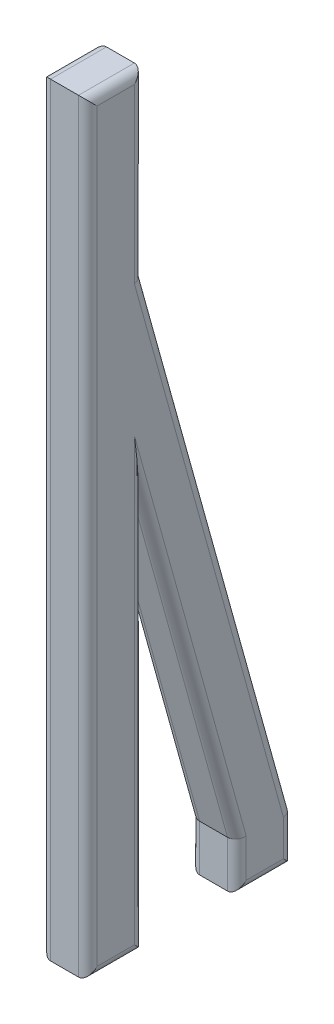
ISO-10303-21;
HEADER;
FILE_DESCRIPTION(('STEP AP214'),'2;1');
FILE_NAME('part.step','',(''),(''),'','','');
FILE_SCHEMA(('AUTOMOTIVE_DESIGN { 1 0 10303 214 1 1 1 1 }'));
ENDSEC;
DATA;
#1=APPLICATION_CONTEXT('core data for automotive mechanical design processes');
#2=APPLICATION_PROTOCOL_DEFINITION('international standard','automotive_design',2000,#1);
#3=PRODUCT_CONTEXT('',#1,'mechanical');
#4=PRODUCT('Part','Part','',(#3));
#5=PRODUCT_RELATED_PRODUCT_CATEGORY('part','',(#4));
#6=PRODUCT_DEFINITION_FORMATION('','',#4);
#7=PRODUCT_DEFINITION_CONTEXT('part definition',#1,'design');
#8=PRODUCT_DEFINITION('design','',#6,#7);
#9=PRODUCT_DEFINITION_SHAPE('','',#8);
#10=(LENGTH_UNIT() NAMED_UNIT(*) SI_UNIT(.MILLI.,.METRE.));
#11=(NAMED_UNIT(*) PLANE_ANGLE_UNIT() SI_UNIT($,.RADIAN.));
#12=(NAMED_UNIT(*) SI_UNIT($,.STERADIAN.) SOLID_ANGLE_UNIT());
#13=UNCERTAINTY_MEASURE_WITH_UNIT(LENGTH_MEASURE(1.E-05),#10,'distance_accuracy_value','');
#14=(GEOMETRIC_REPRESENTATION_CONTEXT(3) GLOBAL_UNCERTAINTY_ASSIGNED_CONTEXT((#13)) GLOBAL_UNIT_ASSIGNED_CONTEXT((#10,
#11,#12)) REPRESENTATION_CONTEXT('',''));
#15=CARTESIAN_POINT('',(0.,0.,0.));
#16=DIRECTION('',(0.,0.,1.));
#17=DIRECTION('',(1.,0.,0.));
#18=AXIS2_PLACEMENT_3D('',#15,#16,#17);
#19=CARTESIAN_POINT('',(5.,1.54727793696275,-5.57020057306589));
#20=DIRECTION('',(0.,-0.267643863786095,0.963517909629941));
#21=DIRECTION('',(0.,-0.963517909629941,-0.267643863786095));
#22=AXIS2_PLACEMENT_3D('',#19,#20,#21);
#23=PLANE('',#22);
#24=DIRECTION('',(-1.,0.,0.));
#25=VECTOR('',#24,1.);
#26=CARTESIAN_POINT('',(5.,0.,-6.));
#27=LINE('',#26,#25);
#28=CARTESIAN_POINT('',(3.,0.,-6.));
#29=VERTEX_POINT('',#28);
#30=CARTESIAN_POINT('',(-3.,0.,-6.));
#31=VERTEX_POINT('',#30);
#32=EDGE_CURVE('E337',#29,#31,#27,.T.);
#33=ORIENTED_EDGE('',*,*,#32,.T.);
#34=DIRECTION('',(0.,0.963517909629941,0.267643863786095));
#35=VECTOR('',#34,1.);
#36=CARTESIAN_POINT('',(-3.,-72.,-26.));
#37=LINE('',#36,#35);
#38=CARTESIAN_POINT('',(-3.,-72.,-26.));
#39=VERTEX_POINT('',#38);
#40=EDGE_CURVE('E277',#31,#39,#37,.F.);
#41=ORIENTED_EDGE('',*,*,#40,.T.);
#42=DIRECTION('',(-1.,0.,0.));
#43=VECTOR('',#42,1.);
#44=CARTESIAN_POINT('',(5.,-72.,-26.));
#45=LINE('',#44,#43);
#46=CARTESIAN_POINT('',(3.,-72.,-26.));
#47=VERTEX_POINT('',#46);
#48=EDGE_CURVE('E207',#47,#39,#45,.T.);
#49=ORIENTED_EDGE('',*,*,#48,.F.);
#50=DIRECTION('',(0.,0.963517909629941,0.267643863786095));
#51=VECTOR('',#50,1.);
#52=CARTESIAN_POINT('',(3.,1.54727793696275,-5.57020057306589));
#53=LINE('',#52,#51);
#54=EDGE_CURVE('E274',#47,#29,#53,.T.);
#55=ORIENTED_EDGE('',*,*,#54,.T.);
#56=EDGE_LOOP('',(#33,#41,#49,#55));
#57=FACE_BOUND('',#56,.T.);
#58=ADVANCED_FACE('F47',(#57),#23,.T.);
#59=CARTESIAN_POINT('',(5.,0.,-26.));
#60=DIRECTION('',(0.,0.,1.));
#61=DIRECTION('',(1.,0.,0.));
#62=AXIS2_PLACEMENT_3D('',#59,#60,#61);
#63=PLANE('',#62);
#64=ORIENTED_EDGE('',*,*,#48,.T.);
#65=DIRECTION('',(0.,1.,0.));
#66=VECTOR('',#65,1.);
#67=CARTESIAN_POINT('',(-3.,-82.,-26.));
#68=LINE('',#67,#66);
#69=CARTESIAN_POINT('',(-3.,-82.,-26.));
#70=VERTEX_POINT('',#69);
#71=EDGE_CURVE('E192',#39,#70,#68,.F.);
#72=ORIENTED_EDGE('',*,*,#71,.T.);
#73=DIRECTION('',(-1.,0.,0.));
#74=VECTOR('',#73,1.);
#75=CARTESIAN_POINT('',(5.,-82.,-26.));
#76=LINE('',#75,#74);
#77=CARTESIAN_POINT('',(3.,-82.,-26.));
#78=VERTEX_POINT('',#77);
#79=EDGE_CURVE('E404',#78,#70,#76,.T.);
#80=ORIENTED_EDGE('',*,*,#79,.F.);
#81=DIRECTION('',(0.,1.,0.));
#82=VECTOR('',#81,1.);
#83=CARTESIAN_POINT('',(3.,0.,-26.));
#84=LINE('',#83,#82);
#85=EDGE_CURVE('E214',#78,#47,#84,.T.);
#86=ORIENTED_EDGE('',*,*,#85,.T.);
#87=EDGE_LOOP('',(#64,#72,#80,#86));
#88=FACE_BOUND('',#87,.T.);
#89=ADVANCED_FACE('F402',(#88),#63,.T.);
#90=CARTESIAN_POINT('',(5.,-82.,0.));
#91=DIRECTION('',(0.,-1.,0.));
#92=DIRECTION('',(0.,0.,-1.));
#93=AXIS2_PLACEMENT_3D('',#90,#91,#92);
#94=PLANE('',#93);
#95=ORIENTED_EDGE('',*,*,#79,.T.);
#96=DIRECTION('',(0.,0.,1.));
#97=VECTOR('',#96,1.);
#98=CARTESIAN_POINT('',(-3.,-82.,-38.));
#99=LINE('',#98,#97);
#100=CARTESIAN_POINT('',(-3.,-82.,-38.));
#101=VERTEX_POINT('',#100);
#102=EDGE_CURVE('E228',#70,#101,#99,.F.);
#103=ORIENTED_EDGE('',*,*,#102,.T.);
#104=DIRECTION('',(-1.,0.,0.));
#105=VECTOR('',#104,1.);
#106=CARTESIAN_POINT('',(5.,-82.,-38.));
#107=LINE('',#106,#105);
#108=CARTESIAN_POINT('',(3.,-82.,-38.));
#109=VERTEX_POINT('',#108);
#110=EDGE_CURVE('E411',#109,#101,#107,.T.);
#111=ORIENTED_EDGE('',*,*,#110,.F.);
#112=DIRECTION('',(0.,0.,1.));
#113=VECTOR('',#112,1.);
#114=CARTESIAN_POINT('',(3.,-82.,0.));
#115=LINE('',#114,#113);
#116=EDGE_CURVE('E225',#109,#78,#115,.T.);
#117=ORIENTED_EDGE('',*,*,#116,.T.);
#118=EDGE_LOOP('',(#95,#103,#111,#117));
#119=FACE_BOUND('',#118,.T.);
#120=ADVANCED_FACE('F445',(#119),#94,.T.);
#121=CARTESIAN_POINT('',(5.,0.,-38.));
#122=DIRECTION('',(0.,0.,-1.));
#123=DIRECTION('',(-1.,0.,0.));
#124=AXIS2_PLACEMENT_3D('',#121,#122,#123);
#125=PLANE('',#124);
#126=ORIENTED_EDGE('',*,*,#110,.T.);
#127=DIRECTION('',(0.,-1.,0.));
#128=VECTOR('',#127,1.);
#129=CARTESIAN_POINT('',(-3.,-72.,-38.));
#130=LINE('',#129,#128);
#131=CARTESIAN_POINT('',(-3.,-72.,-38.));
#132=VERTEX_POINT('',#131);
#133=EDGE_CURVE('E234',#101,#132,#130,.F.);
#134=ORIENTED_EDGE('',*,*,#133,.T.);
#135=DIRECTION('',(-1.,0.,0.));
#136=VECTOR('',#135,1.);
#137=CARTESIAN_POINT('',(5.,-72.,-38.));
#138=LINE('',#137,#136);
#139=CARTESIAN_POINT('',(3.,-72.,-38.));
#140=VERTEX_POINT('',#139);
#141=EDGE_CURVE('E448',#140,#132,#138,.T.);
#142=ORIENTED_EDGE('',*,*,#141,.F.);
#143=DIRECTION('',(0.,-1.,0.));
#144=VECTOR('',#143,1.);
#145=CARTESIAN_POINT('',(3.,0.,-38.));
#146=LINE('',#145,#144);
#147=EDGE_CURVE('E231',#140,#109,#146,.T.);
#148=ORIENTED_EDGE('',*,*,#147,.T.);
#149=EDGE_LOOP('',(#126,#134,#142,#148));
#150=FACE_BOUND('',#149,.T.);
#151=ADVANCED_FACE('F755',(#150),#125,.T.);
#152=CARTESIAN_POINT('',(5.,4.64183381088825,-16.7106017191977));
#153=DIRECTION('',(0.,0.267643863786095,-0.963517909629941));
#154=DIRECTION('',(0.,0.963517909629941,0.267643863786095));
#155=AXIS2_PLACEMENT_3D('',#152,#153,#154);
#156=PLANE('',#155);
#157=ORIENTED_EDGE('',*,*,#141,.T.);
#158=DIRECTION('',(0.,-0.963517909629941,-0.267643863786095));
#159=VECTOR('',#158,1.);
#160=CARTESIAN_POINT('',(-3.,43.1999999999999,-5.99999999999999));
#161=LINE('',#160,#159);
#162=CARTESIAN_POINT('',(-3.,43.1999999999999,-6.));
#163=VERTEX_POINT('',#162);
#164=EDGE_CURVE('E240',#132,#163,#161,.F.);
#165=ORIENTED_EDGE('',*,*,#164,.T.);
#166=DIRECTION('',(-1.,0.,0.));
#167=VECTOR('',#166,1.);
#168=CARTESIAN_POINT('',(5.,43.1999999999999,-6.));
#169=LINE('',#168,#167);
#170=CARTESIAN_POINT('',(3.,43.1999999999999,-6.));
#171=VERTEX_POINT('',#170);
#172=EDGE_CURVE('E451',#171,#163,#169,.T.);
#173=ORIENTED_EDGE('',*,*,#172,.F.);
#174=DIRECTION('',(0.,-0.963517909629941,-0.267643863786095));
#175=VECTOR('',#174,1.);
#176=CARTESIAN_POINT('',(3.,4.64183381088825,-16.7106017191977));
#177=LINE('',#176,#175);
#178=EDGE_CURVE('E237',#171,#140,#177,.T.);
#179=ORIENTED_EDGE('',*,*,#178,.T.);
#180=EDGE_LOOP('',(#157,#165,#173,#179));
#181=FACE_BOUND('',#180,.T.);
#182=ADVANCED_FACE('F505',(#181),#156,.T.);
#183=CARTESIAN_POINT('',(5.,0.,-6.));
#184=DIRECTION('',(0.,0.,-1.));
#185=DIRECTION('',(0.,1.,0.));
#186=AXIS2_PLACEMENT_3D('',#183,#184,#185);
#187=PLANE('',#186);
#188=ORIENTED_EDGE('',*,*,#172,.T.);
#189=DIRECTION('',(0.,-1.,0.));
#190=VECTOR('',#189,1.);
#191=CARTESIAN_POINT('',(-3.,82.,-5.99999999999999));
#192=LINE('',#191,#190);
#193=CARTESIAN_POINT('',(-3.,82.,-5.99999999999999));
#194=VERTEX_POINT('',#193);
#195=EDGE_CURVE('E246',#163,#194,#192,.F.);
#196=ORIENTED_EDGE('',*,*,#195,.T.);
#197=DIRECTION('',(-1.,0.,0.));
#198=VECTOR('',#197,1.);
#199=CARTESIAN_POINT('',(5.,82.,-5.99999999999999));
#200=LINE('',#199,#198);
#201=CARTESIAN_POINT('',(3.,82.,-5.99999999999999));
#202=VERTEX_POINT('',#201);
#203=EDGE_CURVE('E457',#202,#194,#200,.T.);
#204=ORIENTED_EDGE('',*,*,#203,.F.);
#205=DIRECTION('',(0.,-1.,0.));
#206=VECTOR('',#205,1.);
#207=CARTESIAN_POINT('',(3.,0.,-6.));
#208=LINE('',#207,#206);
#209=EDGE_CURVE('E243',#202,#171,#208,.T.);
#210=ORIENTED_EDGE('',*,*,#209,.T.);
#211=EDGE_LOOP('',(#188,#196,#204,#210));
#212=FACE_BOUND('',#211,.T.);
#213=ADVANCED_FACE('F508',(#212),#187,.T.);
#214=CARTESIAN_POINT('',(5.,82.,0.));
#215=DIRECTION('',(0.,1.,0.));
#216=DIRECTION('',(0.,0.,1.));
#217=AXIS2_PLACEMENT_3D('',#214,#215,#216);
#218=PLANE('',#217);
#219=ORIENTED_EDGE('',*,*,#203,.T.);
#220=DIRECTION('',(0.,0.,-1.));
#221=VECTOR('',#220,1.);
#222=CARTESIAN_POINT('',(-3.,82.,6.00000000000001));
#223=LINE('',#222,#221);
#224=CARTESIAN_POINT('',(-3.,82.,6.00000000000001));
#225=VERTEX_POINT('',#224);
#226=EDGE_CURVE('E252',#194,#225,#223,.F.);
#227=ORIENTED_EDGE('',*,*,#226,.T.);
#228=DIRECTION('',(-1.,0.,0.));
#229=VECTOR('',#228,1.);
#230=CARTESIAN_POINT('',(5.,82.,6.00000000000001));
#231=LINE('',#230,#229);
#232=CARTESIAN_POINT('',(3.,82.,6.00000000000001));
#233=VERTEX_POINT('',#232);
#234=EDGE_CURVE('E461',#233,#225,#231,.T.);
#235=ORIENTED_EDGE('',*,*,#234,.F.);
#236=DIRECTION('',(0.,0.,-1.));
#237=VECTOR('',#236,1.);
#238=CARTESIAN_POINT('',(3.,82.,0.));
#239=LINE('',#238,#237);
#240=EDGE_CURVE('E249',#233,#202,#239,.T.);
#241=ORIENTED_EDGE('',*,*,#240,.T.);
#242=EDGE_LOOP('',(#219,#227,#235,#241));
#243=FACE_BOUND('',#242,.T.);
#244=ADVANCED_FACE('F732',(#243),#218,.T.);
#245=CARTESIAN_POINT('',(5.,0.,6.));
#246=DIRECTION('',(0.,0.,-1.));
#247=DIRECTION('',(0.,1.,0.));
#248=AXIS2_PLACEMENT_3D('',#245,#246,#247);
#249=PLANE('',#248);
#250=ORIENTED_EDGE('',*,*,#234,.T.);
#251=DIRECTION('',(0.,-1.,0.));
#252=VECTOR('',#251,1.);
#253=CARTESIAN_POINT('',(-3.,0.,6.));
#254=LINE('',#253,#252);
#255=CARTESIAN_POINT('',(-3.,-82.,5.99999999999999));
#256=VERTEX_POINT('',#255);
#257=EDGE_CURVE('E258',#225,#256,#254,.T.);
#258=ORIENTED_EDGE('',*,*,#257,.T.);
#259=DIRECTION('',(-1.,0.,0.));
#260=VECTOR('',#259,1.);
#261=CARTESIAN_POINT('',(5.,-82.,5.99999999999999));
#262=LINE('',#261,#260);
#263=CARTESIAN_POINT('',(3.,-82.,5.99999999999999));
#264=VERTEX_POINT('',#263);
#265=EDGE_CURVE('E465',#264,#256,#262,.T.);
#266=ORIENTED_EDGE('',*,*,#265,.F.);
#267=DIRECTION('',(0.,-1.,0.));
#268=VECTOR('',#267,1.);
#269=CARTESIAN_POINT('',(3.,82.,6.00000000000001));
#270=LINE('',#269,#268);
#271=EDGE_CURVE('E255',#264,#233,#270,.F.);
#272=ORIENTED_EDGE('',*,*,#271,.T.);
#273=EDGE_LOOP('',(#250,#258,#266,#272));
#274=FACE_BOUND('',#273,.T.);
#275=ADVANCED_FACE('F723',(#274),#249,.F.);
#276=CARTESIAN_POINT('',(5.,-82.,0.));
#277=DIRECTION('',(0.,1.,0.));
#278=DIRECTION('',(0.,0.,1.));
#279=AXIS2_PLACEMENT_3D('',#276,#277,#278);
#280=PLANE('',#279);
#281=ORIENTED_EDGE('',*,*,#265,.T.);
#282=DIRECTION('',(0.,0.,-1.));
#283=VECTOR('',#282,1.);
#284=CARTESIAN_POINT('',(-3.,-82.,0.));
#285=LINE('',#284,#283);
#286=CARTESIAN_POINT('',(-3.,-82.,-6.00000000000001));
#287=VERTEX_POINT('',#286);
#288=EDGE_CURVE('E264',#256,#287,#285,.T.);
#289=ORIENTED_EDGE('',*,*,#288,.T.);
#290=DIRECTION('',(-1.,0.,0.));
#291=VECTOR('',#290,1.);
#292=CARTESIAN_POINT('',(5.,-82.,-6.00000000000001));
#293=LINE('',#292,#291);
#294=CARTESIAN_POINT('',(3.,-82.,-6.00000000000001));
#295=VERTEX_POINT('',#294);
#296=EDGE_CURVE('E469',#295,#287,#293,.T.);
#297=ORIENTED_EDGE('',*,*,#296,.F.);
#298=DIRECTION('',(0.,0.,-1.));
#299=VECTOR('',#298,1.);
#300=CARTESIAN_POINT('',(3.,-82.,5.99999999999999));
#301=LINE('',#300,#299);
#302=EDGE_CURVE('E261',#295,#264,#301,.F.);
#303=ORIENTED_EDGE('',*,*,#302,.T.);
#304=EDGE_LOOP('',(#281,#289,#297,#303));
#305=FACE_BOUND('',#304,.T.);
#306=ADVANCED_FACE('F715',(#305),#280,.F.);
#307=ORIENTED_EDGE('',*,*,#296,.T.);
#308=DIRECTION('',(0.,-1.,0.));
#309=VECTOR('',#308,1.);
#310=CARTESIAN_POINT('',(-3.,0.,-6.));
#311=LINE('',#310,#309);
#312=EDGE_CURVE('E271',#287,#31,#311,.F.);
#313=ORIENTED_EDGE('',*,*,#312,.T.);
#314=ORIENTED_EDGE('',*,*,#32,.F.);
#315=DIRECTION('',(0.,-1.,0.));
#316=VECTOR('',#315,1.);
#317=CARTESIAN_POINT('',(3.,0.,-6.));
#318=LINE('',#317,#316);
#319=EDGE_CURVE('E267',#29,#295,#318,.T.);
#320=ORIENTED_EDGE('',*,*,#319,.T.);
#321=EDGE_LOOP('',(#307,#313,#314,#320));
#322=FACE_BOUND('',#321,.T.);
#323=ADVANCED_FACE('F707',(#322),#187,.T.);
#324=CARTESIAN_POINT('',(5.,0.,0.));
#325=DIRECTION('',(1.,0.,0.));
#326=DIRECTION('',(0.,0.,-1.));
#327=AXIS2_PLACEMENT_3D('',#324,#325,#326);
#328=PLANE('',#327);
#329=DIRECTION('',(0.,0.,-1.));
#330=VECTOR('',#329,1.);
#331=CARTESIAN_POINT('',(5.,-80.,-6.00000000000001));
#332=LINE('',#331,#330);
#333=CARTESIAN_POINT('',(5.,-80.,3.99999999999999));
#334=VERTEX_POINT('',#333);
#335=CARTESIAN_POINT('',(5.,-80.,-4.00000000000001));
#336=VERTEX_POINT('',#335);
#337=EDGE_CURVE('E57',#334,#336,#332,.T.);
#338=ORIENTED_EDGE('',*,*,#337,.T.);
#339=DIRECTION('',(0.,-1.,0.));
#340=VECTOR('',#339,1.);
#341=CARTESIAN_POINT('',(5.,0.,-4.));
#342=LINE('',#341,#340);
#343=CARTESIAN_POINT('',(5.,14.6726166769077,-4.));
#344=VERTEX_POINT('',#343);
#345=EDGE_CURVE('E11',#336,#344,#342,.F.);
#346=ORIENTED_EDGE('',*,*,#345,.T.);
#347=DIRECTION('',(0.,0.963517909629941,0.267643863786095));
#348=VECTOR('',#347,1.);
#349=CARTESIAN_POINT('',(5.,2.08256566453494,-7.49723639232578));
#350=LINE('',#349,#348);
#351=CARTESIAN_POINT('',(5.,-71.7273833230922,-28.));
#352=VERTEX_POINT('',#351);
#353=EDGE_CURVE('E280',#344,#352,#350,.F.);
#354=ORIENTED_EDGE('',*,*,#353,.T.);
#355=DIRECTION('',(0.,1.,0.));
#356=VECTOR('',#355,1.);
#357=CARTESIAN_POINT('',(5.,0.,-28.));
#358=LINE('',#357,#356);
#359=CARTESIAN_POINT('',(5.,-80.,-28.));
#360=VERTEX_POINT('',#359);
#361=EDGE_CURVE('E283',#352,#360,#358,.F.);
#362=ORIENTED_EDGE('',*,*,#361,.T.);
#363=DIRECTION('',(0.,0.,1.));
#364=VECTOR('',#363,1.);
#365=CARTESIAN_POINT('',(5.,-80.,0.));
#366=LINE('',#365,#364);
#367=CARTESIAN_POINT('',(5.,-80.,-36.));
#368=VERTEX_POINT('',#367);
#369=EDGE_CURVE('E286',#360,#368,#366,.F.);
#370=ORIENTED_EDGE('',*,*,#369,.T.);
#371=DIRECTION('',(0.,-1.,0.));
#372=VECTOR('',#371,1.);
#373=CARTESIAN_POINT('',(5.,0.,-36.));
#374=LINE('',#373,#372);
#375=CARTESIAN_POINT('',(5.,-72.2726166769077,-36.));
#376=VERTEX_POINT('',#375);
#377=EDGE_CURVE('E289',#368,#376,#374,.F.);
#378=ORIENTED_EDGE('',*,*,#377,.T.);
#379=DIRECTION('',(0.,-0.963517909629941,-0.267643863786095));
#380=VECTOR('',#379,1.);
#381=CARTESIAN_POINT('',(5.,4.10654608331606,-14.7835658999378));
#382=LINE('',#381,#380);
#383=CARTESIAN_POINT('',(5.,42.9273833230921,-3.99999999999999));
#384=VERTEX_POINT('',#383);
#385=EDGE_CURVE('E292',#376,#384,#382,.F.);
#386=ORIENTED_EDGE('',*,*,#385,.T.);
#387=DIRECTION('',(0.,-1.,0.));
#388=VECTOR('',#387,1.);
#389=CARTESIAN_POINT('',(5.,0.,-4.));
#390=LINE('',#389,#388);
#391=CARTESIAN_POINT('',(5.,80.,-3.99999999999999));
#392=VERTEX_POINT('',#391);
#393=EDGE_CURVE('E295',#384,#392,#390,.F.);
#394=ORIENTED_EDGE('',*,*,#393,.T.);
#395=DIRECTION('',(0.,0.,-1.));
#396=VECTOR('',#395,1.);
#397=CARTESIAN_POINT('',(5.,80.,0.));
#398=LINE('',#397,#396);
#399=CARTESIAN_POINT('',(5.,80.,4.00000000000001));
#400=VERTEX_POINT('',#399);
#401=EDGE_CURVE('E298',#392,#400,#398,.F.);
#402=ORIENTED_EDGE('',*,*,#401,.T.);
#403=DIRECTION('',(0.,-1.,0.));
#404=VECTOR('',#403,1.);
#405=CARTESIAN_POINT('',(5.,-82.,3.99999999999999));
#406=LINE('',#405,#404);
#407=EDGE_CURVE('E68',#400,#334,#406,.T.);
#408=ORIENTED_EDGE('',*,*,#407,.T.);
#409=EDGE_LOOP('',(#338,#346,#354,#362,#370,#378,#386,#394,#402,#408));
#410=FACE_BOUND('',#409,.T.);
#411=ADVANCED_FACE('F385',(#410),#328,.T.);
#412=CARTESIAN_POINT('',(-5.,0.,0.));
#413=DIRECTION('',(1.,0.,0.));
#414=DIRECTION('',(0.,0.,-1.));
#415=AXIS2_PLACEMENT_3D('',#412,#413,#414);
#416=PLANE('',#415);
#417=DIRECTION('',(0.,0.,1.));
#418=VECTOR('',#417,1.);
#419=CARTESIAN_POINT('',(-5.,-80.,-26.));
#420=LINE('',#419,#418);
#421=CARTESIAN_POINT('',(-5.,-80.,-36.));
#422=VERTEX_POINT('',#421);
#423=CARTESIAN_POINT('',(-5.,-80.,-28.));
#424=VERTEX_POINT('',#423);
#425=EDGE_CURVE('E211',#422,#424,#420,.T.);
#426=ORIENTED_EDGE('',*,*,#425,.T.);
#427=DIRECTION('',(0.,1.,0.));
#428=VECTOR('',#427,1.);
#429=CARTESIAN_POINT('',(-5.,-72.,-28.));
#430=LINE('',#429,#428);
#431=CARTESIAN_POINT('',(-5.,-71.7273833230922,-28.));
#432=VERTEX_POINT('',#431);
#433=EDGE_CURVE('E190',#424,#432,#430,.T.);
#434=ORIENTED_EDGE('',*,*,#433,.T.);
#435=DIRECTION('',(0.,0.963517909629941,0.267643863786095));
#436=VECTOR('',#435,1.);
#437=CARTESIAN_POINT('',(-5.,0.535287727572151,-7.92703581925988));
#438=LINE('',#437,#436);
#439=CARTESIAN_POINT('',(-5.,14.6726166769077,-4.));
#440=VERTEX_POINT('',#439);
#441=EDGE_CURVE('E199',#432,#440,#438,.T.);
#442=ORIENTED_EDGE('',*,*,#441,.T.);
#443=DIRECTION('',(0.,-1.,0.));
#444=VECTOR('',#443,1.);
#445=CARTESIAN_POINT('',(-5.,-82.,-4.00000000000001));
#446=LINE('',#445,#444);
#447=CARTESIAN_POINT('',(-5.,-80.,-4.00000000000001));
#448=VERTEX_POINT('',#447);
#449=EDGE_CURVE('E206',#440,#448,#446,.T.);
#450=ORIENTED_EDGE('',*,*,#449,.T.);
#451=DIRECTION('',(0.,0.,-1.));
#452=VECTOR('',#451,1.);
#453=CARTESIAN_POINT('',(-5.,-80.,0.));
#454=LINE('',#453,#452);
#455=CARTESIAN_POINT('',(-5.,-80.,3.99999999999999));
#456=VERTEX_POINT('',#455);
#457=EDGE_CURVE('E417',#448,#456,#454,.F.);
#458=ORIENTED_EDGE('',*,*,#457,.T.);
#459=DIRECTION('',(0.,-1.,0.));
#460=VECTOR('',#459,1.);
#461=CARTESIAN_POINT('',(-5.,0.,4.));
#462=LINE('',#461,#460);
#463=CARTESIAN_POINT('',(-5.,80.,4.00000000000001));
#464=VERTEX_POINT('',#463);
#465=EDGE_CURVE('E420',#456,#464,#462,.F.);
#466=ORIENTED_EDGE('',*,*,#465,.T.);
#467=DIRECTION('',(0.,0.,-1.));
#468=VECTOR('',#467,1.);
#469=CARTESIAN_POINT('',(-5.,80.,-5.99999999999999));
#470=LINE('',#469,#468);
#471=CARTESIAN_POINT('',(-5.,80.,-3.99999999999999));
#472=VERTEX_POINT('',#471);
#473=EDGE_CURVE('E423',#464,#472,#470,.T.);
#474=ORIENTED_EDGE('',*,*,#473,.T.);
#475=DIRECTION('',(0.,-1.,0.));
#476=VECTOR('',#475,1.);
#477=CARTESIAN_POINT('',(-5.,43.1999999999999,-3.99999999999999));
#478=LINE('',#477,#476);
#479=CARTESIAN_POINT('',(-5.,42.9273833230921,-3.99999999999999));
#480=VERTEX_POINT('',#479);
#481=EDGE_CURVE('E426',#472,#480,#478,.T.);
#482=ORIENTED_EDGE('',*,*,#481,.T.);
#483=DIRECTION('',(0.,-0.963517909629941,-0.267643863786095));
#484=VECTOR('',#483,1.);
#485=CARTESIAN_POINT('',(-5.,-72.5352877275722,-36.0729641807401));
#486=LINE('',#485,#484);
#487=CARTESIAN_POINT('',(-5.,-72.2726166769077,-36.));
#488=VERTEX_POINT('',#487);
#489=EDGE_CURVE('E429',#480,#488,#486,.T.);
#490=ORIENTED_EDGE('',*,*,#489,.T.);
#491=DIRECTION('',(0.,-1.,0.));
#492=VECTOR('',#491,1.);
#493=CARTESIAN_POINT('',(-5.,-82.,-36.));
#494=LINE('',#493,#492);
#495=EDGE_CURVE('E219',#488,#422,#494,.T.);
#496=ORIENTED_EDGE('',*,*,#495,.T.);
#497=EDGE_LOOP('',(#426,#434,#442,#450,#458,#466,#474,#482,#490,#496));
#498=FACE_BOUND('',#497,.T.);
#499=ADVANCED_FACE('F209',(#498),#416,.F.);
#500=CARTESIAN_POINT('',(-3.,80.,0.));
#501=DIRECTION('',(0.,0.,1.));
#502=DIRECTION('',(1.,0.,0.));
#503=AXIS2_PLACEMENT_3D('',#500,#501,#502);
#504=CYLINDRICAL_SURFACE('',#503,2.);
#505=CARTESIAN_POINT('',(-3.,80.,4.00000000000001));
#506=DIRECTION('',(0.,-0.707106781186548,0.707106781186547));
#507=DIRECTION('',(0.,-0.707106781186547,-0.707106781186548));
#508=AXIS2_PLACEMENT_3D('',#505,#506,#507);
#509=ELLIPSE('',#508,2.82842712474619,2.);
#510=EDGE_CURVE('E329',#225,#464,#509,.T.);
#511=ORIENTED_EDGE('',*,*,#510,.F.);
#512=ORIENTED_EDGE('',*,*,#226,.F.);
#513=CARTESIAN_POINT('',(-3.,80.,-3.99999999999999));
#514=DIRECTION('',(0.,0.707106781186547,0.707106781186548));
#515=DIRECTION('',(0.,-0.707106781186548,0.707106781186547));
#516=AXIS2_PLACEMENT_3D('',#513,#514,#515);
#517=ELLIPSE('',#516,2.82842712474619,2.);
#518=EDGE_CURVE('E333',#472,#194,#517,.F.);
#519=ORIENTED_EDGE('',*,*,#518,.F.);
#520=ORIENTED_EDGE('',*,*,#473,.F.);
#521=EDGE_LOOP('',(#511,#512,#519,#520));
#522=FACE_BOUND('',#521,.T.);
#523=ADVANCED_FACE('F493',(#522),#504,.T.);
#524=CARTESIAN_POINT('',(-3.,0.,-4.));
#525=DIRECTION('',(0.,1.,0.));
#526=DIRECTION('',(0.,0.,1.));
#527=AXIS2_PLACEMENT_3D('',#524,#525,#526);
#528=CYLINDRICAL_SURFACE('',#527,2.);
#529=ORIENTED_EDGE('',*,*,#518,.T.);
#530=ORIENTED_EDGE('',*,*,#195,.F.);
#531=CARTESIAN_POINT('',(-3.,42.9273833230921,-4.));
#532=DIRECTION('',(0.,0.990837501720121,0.135059413537264));
#533=DIRECTION('',(0.,-0.135059413537264,0.990837501720121));
#534=AXIS2_PLACEMENT_3D('',#531,#532,#533);
#535=ELLIPSE('',#534,2.01849445194388,2.);
#536=EDGE_CURVE('E325',#480,#163,#535,.F.);
#537=ORIENTED_EDGE('',*,*,#536,.F.);
#538=ORIENTED_EDGE('',*,*,#481,.F.);
#539=EDGE_LOOP('',(#529,#530,#537,#538));
#540=FACE_BOUND('',#539,.T.);
#541=ADVANCED_FACE('F499',(#540),#528,.T.);
#542=CARTESIAN_POINT('',(-3.,0.,4.));
#543=DIRECTION('',(0.,-1.,0.));
#544=DIRECTION('',(0.,0.,-1.));
#545=AXIS2_PLACEMENT_3D('',#542,#543,#544);
#546=CYLINDRICAL_SURFACE('',#545,2.);
#547=ORIENTED_EDGE('',*,*,#510,.T.);
#548=ORIENTED_EDGE('',*,*,#465,.F.);
#549=CARTESIAN_POINT('',(-3.,-80.,3.99999999999999));
#550=DIRECTION('',(0.,-0.707106781186547,-0.707106781186548));
#551=DIRECTION('',(0.,0.707106781186548,-0.707106781186547));
#552=AXIS2_PLACEMENT_3D('',#549,#550,#551);
#553=ELLIPSE('',#552,2.82842712474619,2.);
#554=EDGE_CURVE('E321',#256,#456,#553,.T.);
#555=ORIENTED_EDGE('',*,*,#554,.F.);
#556=ORIENTED_EDGE('',*,*,#257,.F.);
#557=EDGE_LOOP('',(#547,#548,#555,#556));
#558=FACE_BOUND('',#557,.T.);
#559=ADVANCED_FACE('F488',(#558),#546,.T.);
#560=CARTESIAN_POINT('',(-3.,4.10654608331606,-14.7835658999378));
#561=DIRECTION('',(0.,0.963517909629941,0.267643863786095));
#562=DIRECTION('',(0.,-0.267643863786095,0.963517909629941));
#563=AXIS2_PLACEMENT_3D('',#560,#561,#562);
#564=CYLINDRICAL_SURFACE('',#563,2.);
#565=ORIENTED_EDGE('',*,*,#536,.T.);
#566=ORIENTED_EDGE('',*,*,#164,.F.);
#567=CARTESIAN_POINT('',(-3.,-72.2726166769077,-36.));
#568=DIRECTION('',(0.,0.990837501720121,0.135059413537264));
#569=DIRECTION('',(0.,-0.135059413537264,0.990837501720121));
#570=AXIS2_PLACEMENT_3D('',#567,#568,#569);
#571=ELLIPSE('',#570,2.01849445194388,2.);
#572=EDGE_CURVE('E317',#488,#132,#571,.F.);
#573=ORIENTED_EDGE('',*,*,#572,.F.);
#574=ORIENTED_EDGE('',*,*,#489,.F.);
#575=EDGE_LOOP('',(#565,#566,#573,#574));
#576=FACE_BOUND('',#575,.T.);
#577=ADVANCED_FACE('F502',(#576),#564,.T.);
#578=CARTESIAN_POINT('',(-3.,-80.,0.));
#579=DIRECTION('',(0.,0.,-1.));
#580=DIRECTION('',(-1.,0.,0.));
#581=AXIS2_PLACEMENT_3D('',#578,#579,#580);
#582=CYLINDRICAL_SURFACE('',#581,2.);
#583=ORIENTED_EDGE('',*,*,#554,.T.);
#584=ORIENTED_EDGE('',*,*,#457,.F.);
#585=CARTESIAN_POINT('',(-3.,-80.,-4.00000000000001));
#586=DIRECTION('',(0.,0.707106781186548,-0.707106781186547));
#587=DIRECTION('',(0.,0.707106781186547,0.707106781186548));
#588=AXIS2_PLACEMENT_3D('',#585,#586,#587);
#589=ELLIPSE('',#588,2.82842712474619,2.);
#590=EDGE_CURVE('E313',#287,#448,#589,.T.);
#591=ORIENTED_EDGE('',*,*,#590,.F.);
#592=ORIENTED_EDGE('',*,*,#288,.F.);
#593=EDGE_LOOP('',(#583,#584,#591,#592));
#594=FACE_BOUND('',#593,.T.);
#595=ADVANCED_FACE('F483',(#594),#582,.T.);
#596=CARTESIAN_POINT('',(-3.,0.,-36.));
#597=DIRECTION('',(0.,1.,0.));
#598=DIRECTION('',(0.,0.,1.));
#599=AXIS2_PLACEMENT_3D('',#596,#597,#598);
#600=CYLINDRICAL_SURFACE('',#599,2.);
#601=ORIENTED_EDGE('',*,*,#572,.T.);
#602=ORIENTED_EDGE('',*,*,#133,.F.);
#603=CARTESIAN_POINT('',(-3.,-80.,-36.));
#604=DIRECTION('',(0.,0.707106781186548,-0.707106781186547));
#605=DIRECTION('',(0.,0.707106781186547,0.707106781186548));
#606=AXIS2_PLACEMENT_3D('',#603,#604,#605);
#607=ELLIPSE('',#606,2.82842712474619,2.);
#608=EDGE_CURVE('E309',#422,#101,#607,.F.);
#609=ORIENTED_EDGE('',*,*,#608,.F.);
#610=ORIENTED_EDGE('',*,*,#495,.F.);
#611=EDGE_LOOP('',(#601,#602,#609,#610));
#612=FACE_BOUND('',#611,.T.);
#613=ADVANCED_FACE('F438',(#612),#600,.T.);
#614=CARTESIAN_POINT('',(-3.,0.,-4.));
#615=DIRECTION('',(0.,1.,0.));
#616=DIRECTION('',(0.,0.,1.));
#617=AXIS2_PLACEMENT_3D('',#614,#615,#616);
#618=CYLINDRICAL_SURFACE('',#617,2.);
#619=ORIENTED_EDGE('',*,*,#590,.T.);
#620=ORIENTED_EDGE('',*,*,#449,.F.);
#621=CARTESIAN_POINT('',(-3.,14.6726166769077,-4.));
#622=DIRECTION('',(0.,0.135059413537264,-0.990837501720121));
#623=DIRECTION('',(0.,0.990837501720121,0.135059413537264));
#624=AXIS2_PLACEMENT_3D('',#621,#622,#623);
#625=ELLIPSE('',#624,14.8082976789188,2.);
#626=EDGE_CURVE('E202',#31,#440,#625,.T.);
#627=ORIENTED_EDGE('',*,*,#626,.F.);
#628=ORIENTED_EDGE('',*,*,#312,.F.);
#629=EDGE_LOOP('',(#619,#620,#627,#628));
#630=FACE_BOUND('',#629,.T.);
#631=ADVANCED_FACE('F478',(#630),#618,.T.);
#632=CARTESIAN_POINT('',(-3.,-80.,0.));
#633=DIRECTION('',(0.,0.,-1.));
#634=DIRECTION('',(0.,1.,0.));
#635=AXIS2_PLACEMENT_3D('',#632,#633,#634);
#636=CYLINDRICAL_SURFACE('',#635,2.);
#637=ORIENTED_EDGE('',*,*,#608,.T.);
#638=ORIENTED_EDGE('',*,*,#102,.F.);
#639=CARTESIAN_POINT('',(-3.,-80.,-28.));
#640=DIRECTION('',(0.,-0.707106781186547,-0.707106781186548));
#641=DIRECTION('',(0.,0.707106781186548,-0.707106781186547));
#642=AXIS2_PLACEMENT_3D('',#639,#640,#641);
#643=ELLIPSE('',#642,2.82842712474619,2.);
#644=EDGE_CURVE('E196',#424,#70,#643,.F.);
#645=ORIENTED_EDGE('',*,*,#644,.F.);
#646=ORIENTED_EDGE('',*,*,#425,.F.);
#647=EDGE_LOOP('',(#637,#638,#645,#646));
#648=FACE_BOUND('',#647,.T.);
#649=ADVANCED_FACE('F441',(#648),#636,.T.);
#650=CARTESIAN_POINT('',(-3.,2.08256566453494,-7.49723639232577));
#651=DIRECTION('',(0.,-0.963517909629941,-0.267643863786095));
#652=DIRECTION('',(0.,0.267643863786095,-0.963517909629941));
#653=AXIS2_PLACEMENT_3D('',#650,#651,#652);
#654=CYLINDRICAL_SURFACE('',#653,2.);
#655=ORIENTED_EDGE('',*,*,#626,.T.);
#656=ORIENTED_EDGE('',*,*,#441,.F.);
#657=CARTESIAN_POINT('',(-3.,-71.7273833230922,-28.));
#658=DIRECTION('',(0.,-0.990837501720121,-0.135059413537264));
#659=DIRECTION('',(0.,-0.135059413537264,0.990837501720121));
#660=AXIS2_PLACEMENT_3D('',#657,#658,#659);
#661=ELLIPSE('',#660,2.01849445194388,2.);
#662=EDGE_CURVE('E186',#39,#432,#661,.T.);
#663=ORIENTED_EDGE('',*,*,#662,.F.);
#664=ORIENTED_EDGE('',*,*,#40,.F.);
#665=EDGE_LOOP('',(#655,#656,#663,#664));
#666=FACE_BOUND('',#665,.T.);
#667=ADVANCED_FACE('F200',(#666),#654,.T.);
#668=CARTESIAN_POINT('',(-3.,0.,-28.));
#669=DIRECTION('',(0.,-1.,0.));
#670=DIRECTION('',(0.,0.,-1.));
#671=AXIS2_PLACEMENT_3D('',#668,#669,#670);
#672=CYLINDRICAL_SURFACE('',#671,2.);
#673=ORIENTED_EDGE('',*,*,#644,.T.);
#674=ORIENTED_EDGE('',*,*,#71,.F.);
#675=ORIENTED_EDGE('',*,*,#662,.T.);
#676=ORIENTED_EDGE('',*,*,#433,.F.);
#677=EDGE_LOOP('',(#673,#674,#675,#676));
#678=FACE_BOUND('',#677,.T.);
#679=ADVANCED_FACE('F188',(#678),#672,.T.);
#680=CARTESIAN_POINT('',(3.,4.10654608331606,-14.7835658999378));
#681=DIRECTION('',(0.,-0.963517909629941,-0.267643863786095));
#682=DIRECTION('',(0.,0.267643863786095,-0.963517909629941));
#683=AXIS2_PLACEMENT_3D('',#680,#681,#682);
#684=CYLINDRICAL_SURFACE('',#683,2.);
#685=CARTESIAN_POINT('',(3.,42.9273833230921,-4.));
#686=DIRECTION('',(0.,-0.990837501720121,-0.135059413537264));
#687=DIRECTION('',(0.,-0.135059413537264,0.990837501720121));
#688=AXIS2_PLACEMENT_3D('',#685,#686,#687);
#689=ELLIPSE('',#688,2.01849445194388,2.);
#690=EDGE_CURVE('E367',#384,#171,#689,.F.);
#691=ORIENTED_EDGE('',*,*,#690,.F.);
#692=ORIENTED_EDGE('',*,*,#385,.F.);
#693=CARTESIAN_POINT('',(3.,-72.2726166769077,-36.));
#694=DIRECTION('',(0.,-0.990837501720121,-0.135059413537264));
#695=DIRECTION('',(0.,-0.135059413537264,0.990837501720121));
#696=AXIS2_PLACEMENT_3D('',#693,#694,#695);
#697=ELLIPSE('',#696,2.01849445194388,2.);
#698=EDGE_CURVE('E51',#140,#376,#697,.T.);
#699=ORIENTED_EDGE('',*,*,#698,.F.);
#700=ORIENTED_EDGE('',*,*,#178,.F.);
#701=EDGE_LOOP('',(#691,#692,#699,#700));
#702=FACE_BOUND('',#701,.T.);
#703=ADVANCED_FACE('F49',(#702),#684,.T.);
#704=CARTESIAN_POINT('',(3.,0.,-36.));
#705=DIRECTION('',(0.,-1.,0.));
#706=DIRECTION('',(0.,0.,-1.));
#707=AXIS2_PLACEMENT_3D('',#704,#705,#706);
#708=CYLINDRICAL_SURFACE('',#707,2.);
#709=ORIENTED_EDGE('',*,*,#698,.T.);
#710=ORIENTED_EDGE('',*,*,#377,.F.);
#711=CARTESIAN_POINT('',(3.,-80.,-36.));
#712=DIRECTION('',(0.,-0.707106781186548,0.707106781186547));
#713=DIRECTION('',(0.,0.707106781186547,0.707106781186548));
#714=AXIS2_PLACEMENT_3D('',#711,#712,#713);
#715=ELLIPSE('',#714,2.82842712474619,2.);
#716=EDGE_CURVE('E364',#109,#368,#715,.T.);
#717=ORIENTED_EDGE('',*,*,#716,.F.);
#718=ORIENTED_EDGE('',*,*,#147,.F.);
#719=EDGE_LOOP('',(#709,#710,#717,#718));
#720=FACE_BOUND('',#719,.T.);
#721=ADVANCED_FACE('F380',(#720),#708,.T.);
#722=CARTESIAN_POINT('',(3.,0.,-4.));
#723=DIRECTION('',(0.,-1.,0.));
#724=DIRECTION('',(0.,0.,-1.));
#725=AXIS2_PLACEMENT_3D('',#722,#723,#724);
#726=CYLINDRICAL_SURFACE('',#725,2.);
#727=ORIENTED_EDGE('',*,*,#690,.T.);
#728=ORIENTED_EDGE('',*,*,#209,.F.);
#729=CARTESIAN_POINT('',(3.,80.,-3.99999999999999));
#730=DIRECTION('',(0.,-0.707106781186547,-0.707106781186548));
#731=DIRECTION('',(0.,-0.707106781186548,0.707106781186547));
#732=AXIS2_PLACEMENT_3D('',#729,#730,#731);
#733=ELLIPSE('',#732,2.82842712474619,2.);
#734=EDGE_CURVE('E360',#392,#202,#733,.F.);
#735=ORIENTED_EDGE('',*,*,#734,.F.);
#736=ORIENTED_EDGE('',*,*,#393,.F.);
#737=EDGE_LOOP('',(#727,#728,#735,#736));
#738=FACE_BOUND('',#737,.T.);
#739=ADVANCED_FACE('F510',(#738),#726,.T.);
#740=CARTESIAN_POINT('',(3.,-80.,0.));
#741=DIRECTION('',(0.,0.,1.));
#742=DIRECTION('',(0.,-1.,0.));
#743=AXIS2_PLACEMENT_3D('',#740,#741,#742);
#744=CYLINDRICAL_SURFACE('',#743,2.);
#745=ORIENTED_EDGE('',*,*,#716,.T.);
#746=ORIENTED_EDGE('',*,*,#369,.F.);
#747=CARTESIAN_POINT('',(3.,-80.,-28.));
#748=DIRECTION('',(0.,0.707106781186547,0.707106781186548));
#749=DIRECTION('',(0.,0.707106781186548,-0.707106781186547));
#750=AXIS2_PLACEMENT_3D('',#747,#748,#749);
#751=ELLIPSE('',#750,2.82842712474619,2.);
#752=EDGE_CURVE('E356',#78,#360,#751,.T.);
#753=ORIENTED_EDGE('',*,*,#752,.F.);
#754=ORIENTED_EDGE('',*,*,#116,.F.);
#755=EDGE_LOOP('',(#745,#746,#753,#754));
#756=FACE_BOUND('',#755,.T.);
#757=ADVANCED_FACE('F391',(#756),#744,.T.);
#758=CARTESIAN_POINT('',(3.,80.,0.));
#759=DIRECTION('',(0.,0.,-1.));
#760=DIRECTION('',(-1.,0.,0.));
#761=AXIS2_PLACEMENT_3D('',#758,#759,#760);
#762=CYLINDRICAL_SURFACE('',#761,2.);
#763=ORIENTED_EDGE('',*,*,#734,.T.);
#764=ORIENTED_EDGE('',*,*,#240,.F.);
#765=CARTESIAN_POINT('',(3.,80.,4.00000000000001));
#766=DIRECTION('',(0.,0.707106781186548,-0.707106781186547));
#767=DIRECTION('',(0.,-0.707106781186547,-0.707106781186548));
#768=AXIS2_PLACEMENT_3D('',#765,#766,#767);
#769=ELLIPSE('',#768,2.82842712474619,2.);
#770=EDGE_CURVE('E352',#400,#233,#769,.F.);
#771=ORIENTED_EDGE('',*,*,#770,.F.);
#772=ORIENTED_EDGE('',*,*,#401,.F.);
#773=EDGE_LOOP('',(#763,#764,#771,#772));
#774=FACE_BOUND('',#773,.T.);
#775=ADVANCED_FACE('F514',(#774),#762,.T.);
#776=CARTESIAN_POINT('',(3.,0.,-28.));
#777=DIRECTION('',(0.,1.,0.));
#778=DIRECTION('',(0.,0.,1.));
#779=AXIS2_PLACEMENT_3D('',#776,#777,#778);
#780=CYLINDRICAL_SURFACE('',#779,2.);
#781=ORIENTED_EDGE('',*,*,#752,.T.);
#782=ORIENTED_EDGE('',*,*,#361,.F.);
#783=CARTESIAN_POINT('',(3.,-71.7273833230922,-28.));
#784=DIRECTION('',(0.,0.990837501720121,0.135059413537264));
#785=DIRECTION('',(0.,0.135059413537264,-0.990837501720121));
#786=AXIS2_PLACEMENT_3D('',#783,#784,#785);
#787=ELLIPSE('',#786,2.01849445194388,2.);
#788=EDGE_CURVE('E348',#47,#352,#787,.T.);
#789=ORIENTED_EDGE('',*,*,#788,.F.);
#790=ORIENTED_EDGE('',*,*,#85,.F.);
#791=EDGE_LOOP('',(#781,#782,#789,#790));
#792=FACE_BOUND('',#791,.T.);
#793=ADVANCED_FACE('F395',(#792),#780,.T.);
#794=CARTESIAN_POINT('',(3.,0.,4.));
#795=DIRECTION('',(0.,1.,0.));
#796=DIRECTION('',(0.,0.,1.));
#797=AXIS2_PLACEMENT_3D('',#794,#795,#796);
#798=CYLINDRICAL_SURFACE('',#797,2.);
#799=ORIENTED_EDGE('',*,*,#770,.T.);
#800=ORIENTED_EDGE('',*,*,#271,.F.);
#801=CARTESIAN_POINT('',(3.,-80.,3.99999999999999));
#802=DIRECTION('',(0.,0.707106781186547,0.707106781186548));
#803=DIRECTION('',(0.,0.707106781186548,-0.707106781186547));
#804=AXIS2_PLACEMENT_3D('',#801,#802,#803);
#805=ELLIPSE('',#804,2.82842712474619,2.);
#806=EDGE_CURVE('E344',#334,#264,#805,.F.);
#807=ORIENTED_EDGE('',*,*,#806,.F.);
#808=ORIENTED_EDGE('',*,*,#407,.F.);
#809=EDGE_LOOP('',(#799,#800,#807,#808));
#810=FACE_BOUND('',#809,.T.);
#811=ADVANCED_FACE('F518',(#810),#798,.T.);
#812=CARTESIAN_POINT('',(3.,2.08256566453494,-7.49723639232577));
#813=DIRECTION('',(0.,0.963517909629941,0.267643863786095));
#814=DIRECTION('',(0.,-0.267643863786095,0.963517909629941));
#815=AXIS2_PLACEMENT_3D('',#812,#813,#814);
#816=CYLINDRICAL_SURFACE('',#815,2.);
#817=ORIENTED_EDGE('',*,*,#788,.T.);
#818=ORIENTED_EDGE('',*,*,#353,.F.);
#819=CARTESIAN_POINT('',(3.,14.6726166769077,-4.));
#820=DIRECTION('',(0.,-0.135059413537264,0.990837501720121));
#821=DIRECTION('',(0.,-0.990837501720121,-0.135059413537264));
#822=AXIS2_PLACEMENT_3D('',#819,#820,#821);
#823=ELLIPSE('',#822,14.8082976789188,2.);
#824=EDGE_CURVE('E341',#29,#344,#823,.T.);
#825=ORIENTED_EDGE('',*,*,#824,.F.);
#826=ORIENTED_EDGE('',*,*,#54,.F.);
#827=EDGE_LOOP('',(#817,#818,#825,#826));
#828=FACE_BOUND('',#827,.T.);
#829=ADVANCED_FACE('F528',(#828),#816,.T.);
#830=CARTESIAN_POINT('',(3.,-80.,0.));
#831=DIRECTION('',(0.,0.,1.));
#832=DIRECTION('',(1.,0.,0.));
#833=AXIS2_PLACEMENT_3D('',#830,#831,#832);
#834=CYLINDRICAL_SURFACE('',#833,2.);
#835=ORIENTED_EDGE('',*,*,#806,.T.);
#836=ORIENTED_EDGE('',*,*,#302,.F.);
#837=CARTESIAN_POINT('',(3.,-80.,-4.00000000000001));
#838=DIRECTION('',(0.,-0.707106781186548,0.707106781186547));
#839=DIRECTION('',(0.,0.707106781186547,0.707106781186548));
#840=AXIS2_PLACEMENT_3D('',#837,#838,#839);
#841=ELLIPSE('',#840,2.82842712474619,2.);
#842=EDGE_CURVE('E338',#336,#295,#841,.F.);
#843=ORIENTED_EDGE('',*,*,#842,.F.);
#844=ORIENTED_EDGE('',*,*,#337,.F.);
#845=EDGE_LOOP('',(#835,#836,#843,#844));
#846=FACE_BOUND('',#845,.T.);
#847=ADVANCED_FACE('F522',(#846),#834,.T.);
#848=CARTESIAN_POINT('',(3.,0.,-4.));
#849=DIRECTION('',(0.,-1.,0.));
#850=DIRECTION('',(0.,0.,-1.));
#851=AXIS2_PLACEMENT_3D('',#848,#849,#850);
#852=CYLINDRICAL_SURFACE('',#851,2.);
#853=ORIENTED_EDGE('',*,*,#824,.T.);
#854=ORIENTED_EDGE('',*,*,#345,.F.);
#855=ORIENTED_EDGE('',*,*,#842,.T.);
#856=ORIENTED_EDGE('',*,*,#319,.F.);
#857=EDGE_LOOP('',(#853,#854,#855,#856));
#858=FACE_BOUND('',#857,.T.);
#859=ADVANCED_FACE('F525',(#858),#852,.T.);
#860=CLOSED_SHELL('',(#58,#89,#120,#151,#182,#213,#244,#275,#306,#323,#411,#499,#523,#541,#559,
#577,#595,#613,#631,#649,#667,#679,#703,#721,#739,#757,#775,#793,#811,#829,#847,#859));
#861=MANIFOLD_SOLID_BREP('B2',#860);
#862=ADVANCED_BREP_SHAPE_REPRESENTATION('',(#18,#861),#14);
#863=SHAPE_DEFINITION_REPRESENTATION(#9,#862);
ENDSEC;
END-ISO-10303-21;
